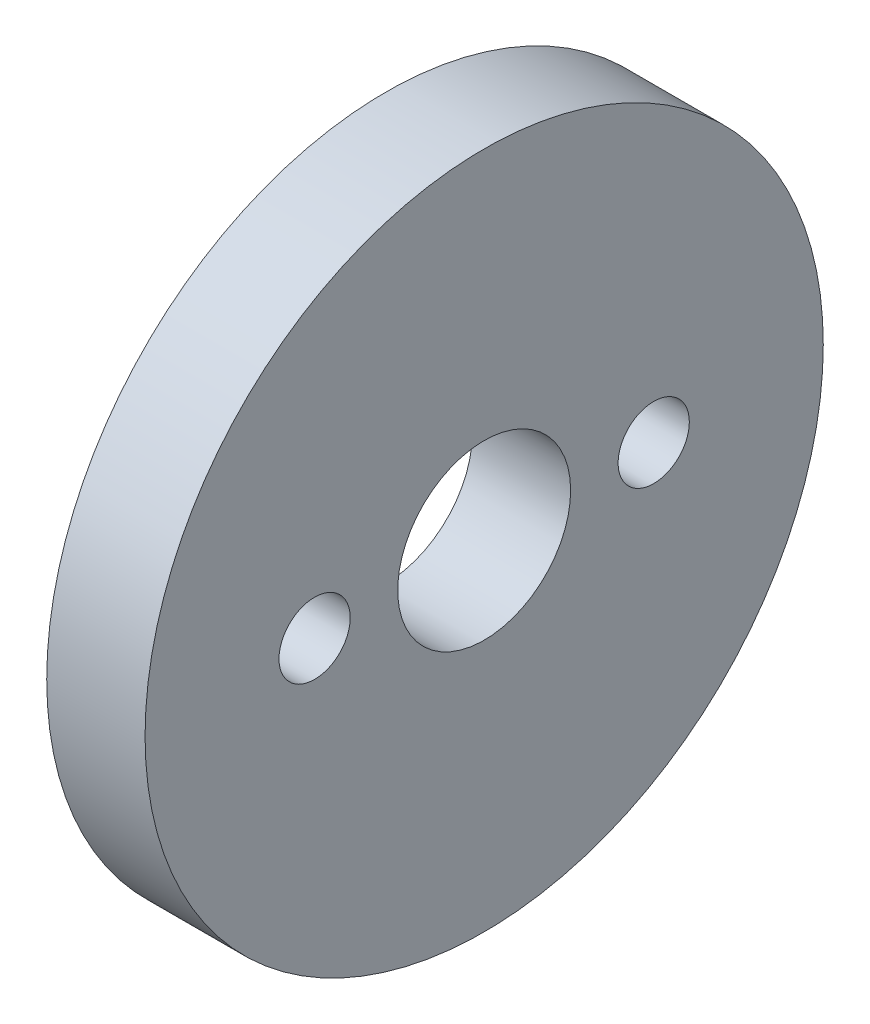
ISO-10303-21;
HEADER;
FILE_DESCRIPTION(('STEP AP214'),'2;1');
FILE_NAME('part.step','',(''),(''),'','','');
FILE_SCHEMA(('AUTOMOTIVE_DESIGN { 1 0 10303 214 1 1 1 1 }'));
ENDSEC;
DATA;
#1=APPLICATION_CONTEXT('core data for automotive mechanical design processes');
#2=APPLICATION_PROTOCOL_DEFINITION('international standard','automotive_design',2000,#1);
#3=PRODUCT_CONTEXT('',#1,'mechanical');
#4=PRODUCT('Part','Part','',(#3));
#5=PRODUCT_RELATED_PRODUCT_CATEGORY('part','',(#4));
#6=PRODUCT_DEFINITION_FORMATION('','',#4);
#7=PRODUCT_DEFINITION_CONTEXT('part definition',#1,'design');
#8=PRODUCT_DEFINITION('design','',#6,#7);
#9=PRODUCT_DEFINITION_SHAPE('','',#8);
#10=(LENGTH_UNIT() NAMED_UNIT(*) SI_UNIT(.MILLI.,.METRE.));
#11=(NAMED_UNIT(*) PLANE_ANGLE_UNIT() SI_UNIT($,.RADIAN.));
#12=(NAMED_UNIT(*) SI_UNIT($,.STERADIAN.) SOLID_ANGLE_UNIT());
#13=UNCERTAINTY_MEASURE_WITH_UNIT(LENGTH_MEASURE(1.E-05),#10,'distance_accuracy_value','');
#14=(GEOMETRIC_REPRESENTATION_CONTEXT(3) GLOBAL_UNCERTAINTY_ASSIGNED_CONTEXT((#13)) GLOBAL_UNIT_ASSIGNED_CONTEXT((#10,
#11,#12)) REPRESENTATION_CONTEXT('',''));
#15=CARTESIAN_POINT('',(0.,0.,0.));
#16=DIRECTION('',(0.,0.,1.));
#17=DIRECTION('',(1.,0.,0.));
#18=AXIS2_PLACEMENT_3D('',#15,#16,#17);
#19=CARTESIAN_POINT('',(5.8,0.,0.));
#20=DIRECTION('',(-1.,0.,0.));
#21=DIRECTION('',(0.,0.,1.));
#22=AXIS2_PLACEMENT_3D('',#19,#20,#21);
#23=CYLINDRICAL_SURFACE('',#22,20.);
#24=CARTESIAN_POINT('',(5.8,0.,0.));
#25=DIRECTION('',(1.,0.,0.));
#26=DIRECTION('',(0.,0.,-1.));
#27=AXIS2_PLACEMENT_3D('',#24,#25,#26);
#28=CIRCLE('',#27,20.);
#29=CARTESIAN_POINT('',(5.8,0.,-20.));
#30=VERTEX_POINT('',#29);
#31=EDGE_CURVE('E10',#30,#30,#28,.T.);
#32=ORIENTED_EDGE('',*,*,#31,.F.);
#33=EDGE_LOOP('',(#32));
#34=FACE_BOUND('',#33,.T.);
#35=CARTESIAN_POINT('',(0.,0.,0.));
#36=DIRECTION('',(1.,0.,0.));
#37=DIRECTION('',(0.,0.,-1.));
#38=AXIS2_PLACEMENT_3D('',#35,#36,#37);
#39=CIRCLE('',#38,20.);
#40=CARTESIAN_POINT('',(0.,0.,-20.));
#41=VERTEX_POINT('',#40);
#42=EDGE_CURVE('E34',#41,#41,#39,.T.);
#43=ORIENTED_EDGE('',*,*,#42,.T.);
#44=EDGE_LOOP('',(#43));
#45=FACE_BOUND('',#44,.T.);
#46=ADVANCED_FACE('F31',(#34,#45),#23,.T.);
#47=CARTESIAN_POINT('',(5.8,0.,0.));
#48=DIRECTION('',(1.,0.,0.));
#49=DIRECTION('',(0.,0.,-1.));
#50=AXIS2_PLACEMENT_3D('',#47,#48,#49);
#51=PLANE('',#50);
#52=CARTESIAN_POINT('',(5.8,0.,-10.));
#53=DIRECTION('',(1.,0.,0.));
#54=DIRECTION('',(0.,0.,-1.));
#55=AXIS2_PLACEMENT_3D('',#52,#53,#54);
#56=CIRCLE('',#55,2.1);
#57=CARTESIAN_POINT('',(5.8,0.,-12.1));
#58=VERTEX_POINT('',#57);
#59=EDGE_CURVE('E55',#58,#58,#56,.T.);
#60=ORIENTED_EDGE('',*,*,#59,.F.);
#61=EDGE_LOOP('',(#60));
#62=FACE_BOUND('',#61,.T.);
#63=CARTESIAN_POINT('',(5.8,0.,10.));
#64=DIRECTION('',(1.,0.,0.));
#65=DIRECTION('',(0.,0.,1.));
#66=AXIS2_PLACEMENT_3D('',#63,#64,#65);
#67=CIRCLE('',#66,2.1);
#68=CARTESIAN_POINT('',(5.8,0.,12.1));
#69=VERTEX_POINT('',#68);
#70=EDGE_CURVE('E49',#69,#69,#67,.T.);
#71=ORIENTED_EDGE('',*,*,#70,.F.);
#72=EDGE_LOOP('',(#71));
#73=FACE_BOUND('',#72,.T.);
#74=CARTESIAN_POINT('',(5.8,0.,0.));
#75=DIRECTION('',(1.,0.,0.));
#76=DIRECTION('',(0.,0.,-1.));
#77=AXIS2_PLACEMENT_3D('',#74,#75,#76);
#78=CIRCLE('',#77,5.1);
#79=CARTESIAN_POINT('',(5.8,0.,-5.1));
#80=VERTEX_POINT('',#79);
#81=EDGE_CURVE('E43',#80,#80,#78,.T.);
#82=ORIENTED_EDGE('',*,*,#81,.F.);
#83=EDGE_LOOP('',(#82));
#84=FACE_BOUND('',#83,.T.);
#85=ORIENTED_EDGE('',*,*,#31,.T.);
#86=EDGE_LOOP('',(#85));
#87=FACE_BOUND('',#86,.T.);
#88=ADVANCED_FACE('F71',(#62,#73,#84,#87),#51,.T.);
#89=CARTESIAN_POINT('',(0.,0.,0.));
#90=DIRECTION('',(1.,0.,0.));
#91=DIRECTION('',(0.,0.,-1.));
#92=AXIS2_PLACEMENT_3D('',#89,#90,#91);
#93=PLANE('',#92);
#94=CARTESIAN_POINT('',(0.,0.,-10.));
#95=DIRECTION('',(1.,0.,0.));
#96=DIRECTION('',(0.,0.,-1.));
#97=AXIS2_PLACEMENT_3D('',#94,#95,#96);
#98=CIRCLE('',#97,2.1);
#99=CARTESIAN_POINT('',(0.,0.,-12.1));
#100=VERTEX_POINT('',#99);
#101=EDGE_CURVE('E41',#100,#100,#98,.T.);
#102=ORIENTED_EDGE('',*,*,#101,.T.);
#103=EDGE_LOOP('',(#102));
#104=FACE_BOUND('',#103,.T.);
#105=CARTESIAN_POINT('',(0.,0.,10.));
#106=DIRECTION('',(1.,0.,0.));
#107=DIRECTION('',(0.,0.,1.));
#108=AXIS2_PLACEMENT_3D('',#105,#106,#107);
#109=CIRCLE('',#108,2.1);
#110=CARTESIAN_POINT('',(0.,0.,12.1));
#111=VERTEX_POINT('',#110);
#112=EDGE_CURVE('E52',#111,#111,#109,.T.);
#113=ORIENTED_EDGE('',*,*,#112,.T.);
#114=EDGE_LOOP('',(#113));
#115=FACE_BOUND('',#114,.T.);
#116=CARTESIAN_POINT('',(0.,0.,0.));
#117=DIRECTION('',(1.,0.,0.));
#118=DIRECTION('',(0.,0.,-1.));
#119=AXIS2_PLACEMENT_3D('',#116,#117,#118);
#120=CIRCLE('',#119,5.1);
#121=CARTESIAN_POINT('',(0.,0.,-5.1));
#122=VERTEX_POINT('',#121);
#123=EDGE_CURVE('E46',#122,#122,#120,.T.);
#124=ORIENTED_EDGE('',*,*,#123,.T.);
#125=EDGE_LOOP('',(#124));
#126=FACE_BOUND('',#125,.T.);
#127=ORIENTED_EDGE('',*,*,#42,.F.);
#128=EDGE_LOOP('',(#127));
#129=FACE_BOUND('',#128,.T.);
#130=ADVANCED_FACE('F61',(#104,#115,#126,#129),#93,.F.);
#131=CARTESIAN_POINT('',(0.,0.,0.));
#132=DIRECTION('',(1.,0.,0.));
#133=DIRECTION('',(0.,0.,-1.));
#134=AXIS2_PLACEMENT_3D('',#131,#132,#133);
#135=CYLINDRICAL_SURFACE('',#134,5.1);
#136=ORIENTED_EDGE('',*,*,#123,.F.);
#137=EDGE_LOOP('',(#136));
#138=FACE_BOUND('',#137,.T.);
#139=ORIENTED_EDGE('',*,*,#81,.T.);
#140=EDGE_LOOP('',(#139));
#141=FACE_BOUND('',#140,.T.);
#142=ADVANCED_FACE('F79',(#138,#141),#135,.F.);
#143=CARTESIAN_POINT('',(0.,0.,10.));
#144=DIRECTION('',(1.,0.,0.));
#145=DIRECTION('',(0.,0.,-1.));
#146=AXIS2_PLACEMENT_3D('',#143,#144,#145);
#147=CYLINDRICAL_SURFACE('',#146,2.1);
#148=ORIENTED_EDGE('',*,*,#112,.F.);
#149=EDGE_LOOP('',(#148));
#150=FACE_BOUND('',#149,.T.);
#151=ORIENTED_EDGE('',*,*,#70,.T.);
#152=EDGE_LOOP('',(#151));
#153=FACE_BOUND('',#152,.T.);
#154=ADVANCED_FACE('F67',(#150,#153),#147,.F.);
#155=CARTESIAN_POINT('',(0.,0.,-10.));
#156=DIRECTION('',(1.,0.,0.));
#157=DIRECTION('',(0.,0.,-1.));
#158=AXIS2_PLACEMENT_3D('',#155,#156,#157);
#159=CYLINDRICAL_SURFACE('',#158,2.1);
#160=ORIENTED_EDGE('',*,*,#101,.F.);
#161=EDGE_LOOP('',(#160));
#162=FACE_BOUND('',#161,.T.);
#163=ORIENTED_EDGE('',*,*,#59,.T.);
#164=EDGE_LOOP('',(#163));
#165=FACE_BOUND('',#164,.T.);
#166=ADVANCED_FACE('F64',(#162,#165),#159,.F.);
#167=CLOSED_SHELL('',(#46,#88,#130,#142,#154,#166));
#168=MANIFOLD_SOLID_BREP('B2',#167);
#169=ADVANCED_BREP_SHAPE_REPRESENTATION('',(#18,#168),#14);
#170=SHAPE_DEFINITION_REPRESENTATION(#9,#169);
ENDSEC;
END-ISO-10303-21;
